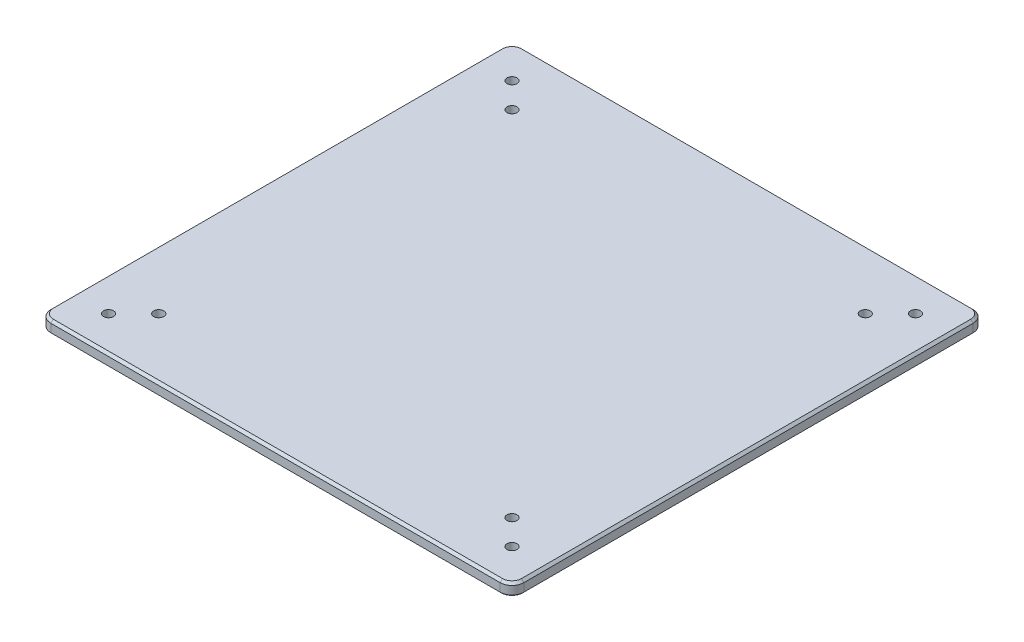
ISO-10303-21;
HEADER;
FILE_DESCRIPTION(('STEP AP214'),'2;1');
FILE_NAME('part.step','',(''),(''),'','','');
FILE_SCHEMA(('AUTOMOTIVE_DESIGN { 1 0 10303 214 1 1 1 1 }'));
ENDSEC;
DATA;
#1=APPLICATION_CONTEXT('core data for automotive mechanical design processes');
#2=APPLICATION_PROTOCOL_DEFINITION('international standard','automotive_design',2000,#1);
#3=PRODUCT_CONTEXT('',#1,'mechanical');
#4=PRODUCT('Part','Part','',(#3));
#5=PRODUCT_RELATED_PRODUCT_CATEGORY('part','',(#4));
#6=PRODUCT_DEFINITION_FORMATION('','',#4);
#7=PRODUCT_DEFINITION_CONTEXT('part definition',#1,'design');
#8=PRODUCT_DEFINITION('design','',#6,#7);
#9=PRODUCT_DEFINITION_SHAPE('','',#8);
#10=(LENGTH_UNIT() NAMED_UNIT(*) SI_UNIT(.MILLI.,.METRE.));
#11=(NAMED_UNIT(*) PLANE_ANGLE_UNIT() SI_UNIT($,.RADIAN.));
#12=(NAMED_UNIT(*) SI_UNIT($,.STERADIAN.) SOLID_ANGLE_UNIT());
#13=UNCERTAINTY_MEASURE_WITH_UNIT(LENGTH_MEASURE(1.E-05),#10,'distance_accuracy_value','');
#14=(GEOMETRIC_REPRESENTATION_CONTEXT(3) GLOBAL_UNCERTAINTY_ASSIGNED_CONTEXT((#13)) GLOBAL_UNIT_ASSIGNED_CONTEXT((#10,
#11,#12)) REPRESENTATION_CONTEXT('',''));
#15=CARTESIAN_POINT('',(0.,0.,0.));
#16=DIRECTION('',(0.,0.,1.));
#17=DIRECTION('',(1.,0.,0.));
#18=AXIS2_PLACEMENT_3D('',#15,#16,#17);
#19=CARTESIAN_POINT('',(0.,5.,0.));
#20=DIRECTION('',(-1.,0.,0.));
#21=DIRECTION('',(0.,0.,1.));
#22=AXIS2_PLACEMENT_3D('',#19,#20,#21);
#23=PLANE('',#22);
#24=DIRECTION('',(0.,-1.,0.));
#25=VECTOR('',#24,1.);
#26=CARTESIAN_POINT('',(0.,5.,195.));
#27=LINE('',#26,#25);
#28=CARTESIAN_POINT('',(0.,4.00000000000006,195.));
#29=VERTEX_POINT('',#28);
#30=CARTESIAN_POINT('',(0.,0.5,195.));
#31=VERTEX_POINT('',#30);
#32=EDGE_CURVE('E294',#29,#31,#27,.T.);
#33=ORIENTED_EDGE('',*,*,#32,.T.);
#34=DIRECTION('',(0.,0.,-1.));
#35=VECTOR('',#34,1.);
#36=CARTESIAN_POINT('',(0.,0.5,5.));
#37=LINE('',#36,#35);
#38=CARTESIAN_POINT('',(0.,0.5,5.));
#39=VERTEX_POINT('',#38);
#40=EDGE_CURVE('E185',#31,#39,#37,.T.);
#41=ORIENTED_EDGE('',*,*,#40,.T.);
#42=DIRECTION('',(0.,-1.,0.));
#43=VECTOR('',#42,1.);
#44=CARTESIAN_POINT('',(0.,5.,5.));
#45=LINE('',#44,#43);
#46=CARTESIAN_POINT('',(0.,4.00000000000006,5.));
#47=VERTEX_POINT('',#46);
#48=EDGE_CURVE('E297',#39,#47,#45,.F.);
#49=ORIENTED_EDGE('',*,*,#48,.T.);
#50=DIRECTION('',(0.,0.,1.));
#51=VECTOR('',#50,1.);
#52=CARTESIAN_POINT('',(0.,4.00000000000006,0.));
#53=LINE('',#52,#51);
#54=EDGE_CURVE('E313',#47,#29,#53,.T.);
#55=ORIENTED_EDGE('',*,*,#54,.T.);
#56=EDGE_LOOP('',(#33,#41,#49,#55));
#57=FACE_BOUND('',#56,.T.);
#58=ADVANCED_FACE('F33',(#57),#23,.F.);
#59=CARTESIAN_POINT('',(0.,5.,0.));
#60=DIRECTION('',(0.,0.,1.));
#61=DIRECTION('',(1.,0.,0.));
#62=AXIS2_PLACEMENT_3D('',#59,#60,#61);
#63=PLANE('',#62);
#64=DIRECTION('',(0.,-1.,0.));
#65=VECTOR('',#64,1.);
#66=CARTESIAN_POINT('',(-5.,5.,0.));
#67=LINE('',#66,#65);
#68=CARTESIAN_POINT('',(-5.,4.00000000000006,0.));
#69=VERTEX_POINT('',#68);
#70=CARTESIAN_POINT('',(-5.,0.5,0.));
#71=VERTEX_POINT('',#70);
#72=EDGE_CURVE('E285',#69,#71,#67,.T.);
#73=ORIENTED_EDGE('',*,*,#72,.T.);
#74=DIRECTION('',(-1.,0.,0.));
#75=VECTOR('',#74,1.);
#76=CARTESIAN_POINT('',(-195.,0.5,0.));
#77=LINE('',#76,#75);
#78=CARTESIAN_POINT('',(-195.,0.5,0.));
#79=VERTEX_POINT('',#78);
#80=EDGE_CURVE('E210',#71,#79,#77,.T.);
#81=ORIENTED_EDGE('',*,*,#80,.T.);
#82=DIRECTION('',(0.,-1.,0.));
#83=VECTOR('',#82,1.);
#84=CARTESIAN_POINT('',(-195.,5.,0.));
#85=LINE('',#84,#83);
#86=CARTESIAN_POINT('',(-195.,4.00000000000006,0.));
#87=VERTEX_POINT('',#86);
#88=EDGE_CURVE('E287',#79,#87,#85,.F.);
#89=ORIENTED_EDGE('',*,*,#88,.T.);
#90=DIRECTION('',(1.,0.,0.));
#91=VECTOR('',#90,1.);
#92=CARTESIAN_POINT('',(0.,4.00000000000006,0.));
#93=LINE('',#92,#91);
#94=EDGE_CURVE('E262',#87,#69,#93,.T.);
#95=ORIENTED_EDGE('',*,*,#94,.T.);
#96=EDGE_LOOP('',(#73,#81,#89,#95));
#97=FACE_BOUND('',#96,.T.);
#98=ADVANCED_FACE('F354',(#97),#63,.F.);
#99=CARTESIAN_POINT('',(-200.,5.,0.));
#100=DIRECTION('',(1.,0.,0.));
#101=DIRECTION('',(0.,0.,-1.));
#102=AXIS2_PLACEMENT_3D('',#99,#100,#101);
#103=PLANE('',#102);
#104=DIRECTION('',(0.,-1.,0.));
#105=VECTOR('',#104,1.);
#106=CARTESIAN_POINT('',(-200.,5.,5.));
#107=LINE('',#106,#105);
#108=CARTESIAN_POINT('',(-200.,4.00000000000006,5.));
#109=VERTEX_POINT('',#108);
#110=CARTESIAN_POINT('',(-200.,0.5,5.));
#111=VERTEX_POINT('',#110);
#112=EDGE_CURVE('E282',#109,#111,#107,.T.);
#113=ORIENTED_EDGE('',*,*,#112,.T.);
#114=DIRECTION('',(0.,0.,1.));
#115=VECTOR('',#114,1.);
#116=CARTESIAN_POINT('',(-200.,0.5,195.));
#117=LINE('',#116,#115);
#118=CARTESIAN_POINT('',(-200.,0.5,195.));
#119=VERTEX_POINT('',#118);
#120=EDGE_CURVE('E11',#111,#119,#117,.T.);
#121=ORIENTED_EDGE('',*,*,#120,.T.);
#122=DIRECTION('',(0.,-1.,0.));
#123=VECTOR('',#122,1.);
#124=CARTESIAN_POINT('',(-200.,5.,195.));
#125=LINE('',#124,#123);
#126=CARTESIAN_POINT('',(-200.,4.00000000000006,195.));
#127=VERTEX_POINT('',#126);
#128=EDGE_CURVE('E283',#119,#127,#125,.F.);
#129=ORIENTED_EDGE('',*,*,#128,.T.);
#130=DIRECTION('',(0.,0.,-1.));
#131=VECTOR('',#130,1.);
#132=CARTESIAN_POINT('',(-200.,4.00000000000006,0.));
#133=LINE('',#132,#131);
#134=EDGE_CURVE('E189',#127,#109,#133,.T.);
#135=ORIENTED_EDGE('',*,*,#134,.T.);
#136=EDGE_LOOP('',(#113,#121,#129,#135));
#137=FACE_BOUND('',#136,.T.);
#138=ADVANCED_FACE('F281',(#137),#103,.F.);
#139=CARTESIAN_POINT('',(0.,5.,200.));
#140=DIRECTION('',(0.,0.,-1.));
#141=DIRECTION('',(-1.,0.,0.));
#142=AXIS2_PLACEMENT_3D('',#139,#140,#141);
#143=PLANE('',#142);
#144=DIRECTION('',(0.,-1.,0.));
#145=VECTOR('',#144,1.);
#146=CARTESIAN_POINT('',(-195.,5.,200.));
#147=LINE('',#146,#145);
#148=CARTESIAN_POINT('',(-195.,4.00000000000006,200.));
#149=VERTEX_POINT('',#148);
#150=CARTESIAN_POINT('',(-195.,0.5,200.));
#151=VERTEX_POINT('',#150);
#152=EDGE_CURVE('E299',#149,#151,#147,.T.);
#153=ORIENTED_EDGE('',*,*,#152,.T.);
#154=DIRECTION('',(1.,0.,0.));
#155=VECTOR('',#154,1.);
#156=CARTESIAN_POINT('',(-4.99999999999997,0.5,200.));
#157=LINE('',#156,#155);
#158=CARTESIAN_POINT('',(-4.99999999999998,0.5,200.));
#159=VERTEX_POINT('',#158);
#160=EDGE_CURVE('E212',#151,#159,#157,.T.);
#161=ORIENTED_EDGE('',*,*,#160,.T.);
#162=DIRECTION('',(0.,-1.,0.));
#163=VECTOR('',#162,1.);
#164=CARTESIAN_POINT('',(-4.99999999999998,5.,200.));
#165=LINE('',#164,#163);
#166=CARTESIAN_POINT('',(-4.99999999999998,4.00000000000006,200.));
#167=VERTEX_POINT('',#166);
#168=EDGE_CURVE('E171',#159,#167,#165,.F.);
#169=ORIENTED_EDGE('',*,*,#168,.T.);
#170=DIRECTION('',(-1.,0.,0.));
#171=VECTOR('',#170,1.);
#172=CARTESIAN_POINT('',(0.,4.00000000000006,200.));
#173=LINE('',#172,#171);
#174=EDGE_CURVE('E267',#167,#149,#173,.T.);
#175=ORIENTED_EDGE('',*,*,#174,.T.);
#176=EDGE_LOOP('',(#153,#161,#169,#175));
#177=FACE_BOUND('',#176,.T.);
#178=ADVANCED_FACE('F340',(#177),#143,.F.);
#179=CARTESIAN_POINT('',(0.,5.,0.));
#180=DIRECTION('',(0.,-1.,0.));
#181=DIRECTION('',(0.,0.,-1.));
#182=AXIS2_PLACEMENT_3D('',#179,#180,#181);
#183=PLANE('',#182);
#184=CARTESIAN_POINT('',(-4.99999999999998,5.,195.));
#185=DIRECTION('',(0.,-1.,0.));
#186=DIRECTION('',(0.,0.,-1.));
#187=AXIS2_PLACEMENT_3D('',#184,#185,#186);
#188=CIRCLE('',#187,4.00000000000005);
#189=CARTESIAN_POINT('',(-4.99999999999998,5.,199.));
#190=VERTEX_POINT('',#189);
#191=CARTESIAN_POINT('',(-0.999999999999922,5.,195.));
#192=VERTEX_POINT('',#191);
#193=EDGE_CURVE('E306',#190,#192,#188,.F.);
#194=ORIENTED_EDGE('',*,*,#193,.T.);
#195=DIRECTION('',(0.,0.,-1.));
#196=VECTOR('',#195,1.);
#197=CARTESIAN_POINT('',(-0.999999999999945,5.,0.));
#198=LINE('',#197,#196);
#199=CARTESIAN_POINT('',(-0.999999999999945,5.,5.));
#200=VERTEX_POINT('',#199);
#201=EDGE_CURVE('E310',#192,#200,#198,.T.);
#202=ORIENTED_EDGE('',*,*,#201,.T.);
#203=CARTESIAN_POINT('',(-5.,5.,5.));
#204=DIRECTION('',(0.,-1.,0.));
#205=DIRECTION('',(0.,0.,-1.));
#206=AXIS2_PLACEMENT_3D('',#203,#204,#205);
#207=CIRCLE('',#206,4.00000000000006);
#208=CARTESIAN_POINT('',(-5.,5.,0.999999999999945));
#209=VERTEX_POINT('',#208);
#210=EDGE_CURVE('E308',#200,#209,#207,.F.);
#211=ORIENTED_EDGE('',*,*,#210,.T.);
#212=DIRECTION('',(-1.,0.,0.));
#213=VECTOR('',#212,1.);
#214=CARTESIAN_POINT('',(0.,5.,0.999999999999945));
#215=LINE('',#214,#213);
#216=CARTESIAN_POINT('',(-195.,5.,0.999999999999941));
#217=VERTEX_POINT('',#216);
#218=EDGE_CURVE('E154',#209,#217,#215,.T.);
#219=ORIENTED_EDGE('',*,*,#218,.T.);
#220=CARTESIAN_POINT('',(-195.,5.,5.));
#221=DIRECTION('',(0.,-1.,0.));
#222=DIRECTION('',(0.,0.,-1.));
#223=AXIS2_PLACEMENT_3D('',#220,#221,#222);
#224=CIRCLE('',#223,4.00000000000006);
#225=CARTESIAN_POINT('',(-199.,5.,5.));
#226=VERTEX_POINT('',#225);
#227=EDGE_CURVE('E147',#217,#226,#224,.F.);
#228=ORIENTED_EDGE('',*,*,#227,.T.);
#229=DIRECTION('',(0.,0.,1.));
#230=VECTOR('',#229,1.);
#231=CARTESIAN_POINT('',(-199.,5.,0.));
#232=LINE('',#231,#230);
#233=CARTESIAN_POINT('',(-199.,5.,195.));
#234=VERTEX_POINT('',#233);
#235=EDGE_CURVE('E151',#226,#234,#232,.T.);
#236=ORIENTED_EDGE('',*,*,#235,.T.);
#237=CARTESIAN_POINT('',(-195.,5.,195.));
#238=DIRECTION('',(0.,-1.,0.));
#239=DIRECTION('',(0.,0.,-1.));
#240=AXIS2_PLACEMENT_3D('',#237,#238,#239);
#241=CIRCLE('',#240,4.00000000000006);
#242=CARTESIAN_POINT('',(-195.,5.,199.));
#243=VERTEX_POINT('',#242);
#244=EDGE_CURVE('E160',#234,#243,#241,.F.);
#245=ORIENTED_EDGE('',*,*,#244,.T.);
#246=DIRECTION('',(1.,0.,0.));
#247=VECTOR('',#246,1.);
#248=CARTESIAN_POINT('',(0.,5.,199.));
#249=LINE('',#248,#247);
#250=EDGE_CURVE('E159',#243,#190,#249,.T.);
#251=ORIENTED_EDGE('',*,*,#250,.T.);
#252=EDGE_LOOP('',(#194,#202,#211,#219,#228,#236,#245,#251));
#253=FACE_BOUND('',#252,.T.);
#254=CARTESIAN_POINT('',(-14.692576694209,5.,14.6925766942088));
#255=DIRECTION('',(0.,1.,0.));
#256=DIRECTION('',(0.,0.,1.));
#257=AXIS2_PLACEMENT_3D('',#254,#255,#256);
#258=CIRCLE('',#257,2.12499999999997);
#259=CARTESIAN_POINT('',(-14.692576694209,5.,16.8175766942088));
#260=VERTEX_POINT('',#259);
#261=EDGE_CURVE('E692',#260,#260,#258,.T.);
#262=ORIENTED_EDGE('',*,*,#261,.F.);
#263=EDGE_LOOP('',(#262));
#264=FACE_BOUND('',#263,.T.);
#265=CARTESIAN_POINT('',(-174.696699141101,5.,25.2991784120071));
#266=DIRECTION('',(0.,1.,0.));
#267=DIRECTION('',(0.,0.,1.));
#268=AXIS2_PLACEMENT_3D('',#265,#266,#267);
#269=CIRCLE('',#268,2.12499999999997);
#270=CARTESIAN_POINT('',(-174.696699141101,5.,27.4241784120071));
#271=VERTEX_POINT('',#270);
#272=EDGE_CURVE('E696',#271,#271,#269,.T.);
#273=ORIENTED_EDGE('',*,*,#272,.F.);
#274=EDGE_LOOP('',(#273));
#275=FACE_BOUND('',#274,.T.);
#276=CARTESIAN_POINT('',(-185.303300858899,5.,14.6925766942089));
#277=DIRECTION('',(0.,1.,0.));
#278=DIRECTION('',(0.,0.,1.));
#279=AXIS2_PLACEMENT_3D('',#276,#277,#278);
#280=CIRCLE('',#279,2.12499999999998);
#281=CARTESIAN_POINT('',(-185.303300858899,5.,16.8175766942089));
#282=VERTEX_POINT('',#281);
#283=EDGE_CURVE('E684',#282,#282,#280,.T.);
#284=ORIENTED_EDGE('',*,*,#283,.F.);
#285=EDGE_LOOP('',(#284));
#286=FACE_BOUND('',#285,.T.);
#287=CARTESIAN_POINT('',(-174.696699141101,5.,174.696699141101));
#288=DIRECTION('',(0.,1.,0.));
#289=DIRECTION('',(0.,0.,1.));
#290=AXIS2_PLACEMENT_3D('',#287,#288,#289);
#291=CIRCLE('',#290,2.12499999999998);
#292=CARTESIAN_POINT('',(-174.696699141101,5.,176.821699141101));
#293=VERTEX_POINT('',#292);
#294=EDGE_CURVE('E688',#293,#293,#291,.T.);
#295=ORIENTED_EDGE('',*,*,#294,.F.);
#296=EDGE_LOOP('',(#295));
#297=FACE_BOUND('',#296,.T.);
#298=CARTESIAN_POINT('',(-25.2991784120072,5.,174.696699141101));
#299=DIRECTION('',(0.,1.,0.));
#300=DIRECTION('',(0.,0.,1.));
#301=AXIS2_PLACEMENT_3D('',#298,#299,#300);
#302=CIRCLE('',#301,2.125);
#303=CARTESIAN_POINT('',(-25.2991784120072,5.,176.821699141101));
#304=VERTEX_POINT('',#303);
#305=EDGE_CURVE('E178',#304,#304,#302,.T.);
#306=ORIENTED_EDGE('',*,*,#305,.F.);
#307=EDGE_LOOP('',(#306));
#308=FACE_BOUND('',#307,.T.);
#309=CARTESIAN_POINT('',(-14.6925766942089,5.,185.303300858899));
#310=DIRECTION('',(0.,1.,0.));
#311=DIRECTION('',(0.,0.,1.));
#312=AXIS2_PLACEMENT_3D('',#309,#310,#311);
#313=CIRCLE('',#312,2.125);
#314=CARTESIAN_POINT('',(-14.6925766942089,5.,187.428300858899));
#315=VERTEX_POINT('',#314);
#316=EDGE_CURVE('E700',#315,#315,#313,.T.);
#317=ORIENTED_EDGE('',*,*,#316,.F.);
#318=EDGE_LOOP('',(#317));
#319=FACE_BOUND('',#318,.T.);
#320=CARTESIAN_POINT('',(-25.2991784120072,5.,25.2991784120071));
#321=DIRECTION('',(0.,1.,0.));
#322=DIRECTION('',(0.,0.,1.));
#323=AXIS2_PLACEMENT_3D('',#320,#321,#322);
#324=CIRCLE('',#323,2.12499999999998);
#325=CARTESIAN_POINT('',(-25.2991784120072,5.,27.4241784120071));
#326=VERTEX_POINT('',#325);
#327=EDGE_CURVE('E704',#326,#326,#324,.T.);
#328=ORIENTED_EDGE('',*,*,#327,.F.);
#329=EDGE_LOOP('',(#328));
#330=FACE_BOUND('',#329,.T.);
#331=CARTESIAN_POINT('',(-185.303300858899,5.,185.303300858899));
#332=DIRECTION('',(0.,1.,0.));
#333=DIRECTION('',(0.,0.,1.));
#334=AXIS2_PLACEMENT_3D('',#331,#332,#333);
#335=CIRCLE('',#334,2.12499999999998);
#336=CARTESIAN_POINT('',(-185.303300858899,5.,187.428300858899));
#337=VERTEX_POINT('',#336);
#338=EDGE_CURVE('E680',#337,#337,#335,.T.);
#339=ORIENTED_EDGE('',*,*,#338,.F.);
#340=EDGE_LOOP('',(#339));
#341=FACE_BOUND('',#340,.T.);
#342=ADVANCED_FACE('F149',(#253,#264,#275,#286,#297,#308,#319,#330,#341),#183,.F.);
#343=CARTESIAN_POINT('',(0.,0.,0.));
#344=DIRECTION('',(0.,-1.,0.));
#345=DIRECTION('',(0.,0.,-1.));
#346=AXIS2_PLACEMENT_3D('',#343,#344,#345);
#347=PLANE('',#346);
#348=CARTESIAN_POINT('',(-5.,0.,5.));
#349=DIRECTION('',(0.,-1.,0.));
#350=DIRECTION('',(0.,0.,-1.));
#351=AXIS2_PLACEMENT_3D('',#348,#349,#350);
#352=CIRCLE('',#351,4.5);
#353=CARTESIAN_POINT('',(-5.,0.,0.5));
#354=VERTEX_POINT('',#353);
#355=CARTESIAN_POINT('',(-0.5,0.,5.));
#356=VERTEX_POINT('',#355);
#357=EDGE_CURVE('E201',#354,#356,#352,.T.);
#358=ORIENTED_EDGE('',*,*,#357,.T.);
#359=DIRECTION('',(0.,0.,1.));
#360=VECTOR('',#359,1.);
#361=CARTESIAN_POINT('',(-0.499999999999977,0.,195.));
#362=LINE('',#361,#360);
#363=CARTESIAN_POINT('',(-0.499999999999971,0.,195.));
#364=VERTEX_POINT('',#363);
#365=EDGE_CURVE('E203',#356,#364,#362,.T.);
#366=ORIENTED_EDGE('',*,*,#365,.T.);
#367=CARTESIAN_POINT('',(-4.99999999999998,0.,195.));
#368=DIRECTION('',(0.,-1.,0.));
#369=DIRECTION('',(0.,0.,-1.));
#370=AXIS2_PLACEMENT_3D('',#367,#368,#369);
#371=CIRCLE('',#370,4.5);
#372=CARTESIAN_POINT('',(-4.99999999999998,0.,199.5));
#373=VERTEX_POINT('',#372);
#374=EDGE_CURVE('E199',#364,#373,#371,.T.);
#375=ORIENTED_EDGE('',*,*,#374,.T.);
#376=DIRECTION('',(-1.,0.,0.));
#377=VECTOR('',#376,1.);
#378=CARTESIAN_POINT('',(-195.,0.,199.5));
#379=LINE('',#378,#377);
#380=CARTESIAN_POINT('',(-195.,0.,199.5));
#381=VERTEX_POINT('',#380);
#382=EDGE_CURVE('E195',#373,#381,#379,.T.);
#383=ORIENTED_EDGE('',*,*,#382,.T.);
#384=CARTESIAN_POINT('',(-195.,0.,195.));
#385=DIRECTION('',(0.,-1.,0.));
#386=DIRECTION('',(0.,0.,-1.));
#387=AXIS2_PLACEMENT_3D('',#384,#385,#386);
#388=CIRCLE('',#387,4.5);
#389=CARTESIAN_POINT('',(-199.5,0.,195.));
#390=VERTEX_POINT('',#389);
#391=EDGE_CURVE('E191',#381,#390,#388,.T.);
#392=ORIENTED_EDGE('',*,*,#391,.T.);
#393=DIRECTION('',(0.,0.,-1.));
#394=VECTOR('',#393,1.);
#395=CARTESIAN_POINT('',(-199.5,0.,5.));
#396=LINE('',#395,#394);
#397=CARTESIAN_POINT('',(-199.5,0.,5.));
#398=VERTEX_POINT('',#397);
#399=EDGE_CURVE('E188',#390,#398,#396,.T.);
#400=ORIENTED_EDGE('',*,*,#399,.T.);
#401=CARTESIAN_POINT('',(-195.,0.,5.));
#402=DIRECTION('',(0.,-1.,0.));
#403=DIRECTION('',(0.,0.,-1.));
#404=AXIS2_PLACEMENT_3D('',#401,#402,#403);
#405=CIRCLE('',#404,4.5);
#406=CARTESIAN_POINT('',(-195.,0.,0.499999999999996));
#407=VERTEX_POINT('',#406);
#408=EDGE_CURVE('E193',#398,#407,#405,.T.);
#409=ORIENTED_EDGE('',*,*,#408,.T.);
#410=DIRECTION('',(1.,0.,0.));
#411=VECTOR('',#410,1.);
#412=CARTESIAN_POINT('',(-5.,0.,0.5));
#413=LINE('',#412,#411);
#414=EDGE_CURVE('E197',#407,#354,#413,.T.);
#415=ORIENTED_EDGE('',*,*,#414,.T.);
#416=EDGE_LOOP('',(#358,#366,#375,#383,#392,#400,#409,#415));
#417=FACE_BOUND('',#416,.T.);
#418=CARTESIAN_POINT('',(-14.692576694209,0.,14.6925766942088));
#419=DIRECTION('',(0.,1.,0.));
#420=DIRECTION('',(0.,0.,1.));
#421=AXIS2_PLACEMENT_3D('',#418,#419,#420);
#422=CIRCLE('',#421,2.12499999999997);
#423=CARTESIAN_POINT('',(-14.692576694209,0.,16.8175766942088));
#424=VERTEX_POINT('',#423);
#425=EDGE_CURVE('E653',#424,#424,#422,.T.);
#426=ORIENTED_EDGE('',*,*,#425,.T.);
#427=EDGE_LOOP('',(#426));
#428=FACE_BOUND('',#427,.T.);
#429=CARTESIAN_POINT('',(-174.696699141101,0.,25.2991784120071));
#430=DIRECTION('',(0.,1.,0.));
#431=DIRECTION('',(0.,0.,1.));
#432=AXIS2_PLACEMENT_3D('',#429,#430,#431);
#433=CIRCLE('',#432,2.12499999999997);
#434=CARTESIAN_POINT('',(-174.696699141101,0.,27.4241784120071));
#435=VERTEX_POINT('',#434);
#436=EDGE_CURVE('E657',#435,#435,#433,.T.);
#437=ORIENTED_EDGE('',*,*,#436,.T.);
#438=EDGE_LOOP('',(#437));
#439=FACE_BOUND('',#438,.T.);
#440=CARTESIAN_POINT('',(-185.303300858899,0.,14.6925766942089));
#441=DIRECTION('',(0.,1.,0.));
#442=DIRECTION('',(0.,0.,1.));
#443=AXIS2_PLACEMENT_3D('',#440,#441,#442);
#444=CIRCLE('',#443,2.12499999999998);
#445=CARTESIAN_POINT('',(-185.303300858899,0.,16.8175766942089));
#446=VERTEX_POINT('',#445);
#447=EDGE_CURVE('E661',#446,#446,#444,.T.);
#448=ORIENTED_EDGE('',*,*,#447,.T.);
#449=EDGE_LOOP('',(#448));
#450=FACE_BOUND('',#449,.T.);
#451=CARTESIAN_POINT('',(-174.696699141101,0.,174.696699141101));
#452=DIRECTION('',(0.,1.,0.));
#453=DIRECTION('',(0.,0.,1.));
#454=AXIS2_PLACEMENT_3D('',#451,#452,#453);
#455=CIRCLE('',#454,2.12499999999998);
#456=CARTESIAN_POINT('',(-174.696699141101,0.,176.821699141101));
#457=VERTEX_POINT('',#456);
#458=EDGE_CURVE('E665',#457,#457,#455,.T.);
#459=ORIENTED_EDGE('',*,*,#458,.T.);
#460=EDGE_LOOP('',(#459));
#461=FACE_BOUND('',#460,.T.);
#462=CARTESIAN_POINT('',(-25.2991784120072,0.,174.696699141101));
#463=DIRECTION('',(0.,1.,0.));
#464=DIRECTION('',(0.,0.,1.));
#465=AXIS2_PLACEMENT_3D('',#462,#463,#464);
#466=CIRCLE('',#465,2.125);
#467=CARTESIAN_POINT('',(-25.2991784120072,0.,176.821699141101));
#468=VERTEX_POINT('',#467);
#469=EDGE_CURVE('E669',#468,#468,#466,.T.);
#470=ORIENTED_EDGE('',*,*,#469,.T.);
#471=EDGE_LOOP('',(#470));
#472=FACE_BOUND('',#471,.T.);
#473=CARTESIAN_POINT('',(-14.6925766942089,0.,185.303300858899));
#474=DIRECTION('',(0.,1.,0.));
#475=DIRECTION('',(0.,0.,1.));
#476=AXIS2_PLACEMENT_3D('',#473,#474,#475);
#477=CIRCLE('',#476,2.125);
#478=CARTESIAN_POINT('',(-14.6925766942089,0.,187.428300858899));
#479=VERTEX_POINT('',#478);
#480=EDGE_CURVE('E673',#479,#479,#477,.T.);
#481=ORIENTED_EDGE('',*,*,#480,.T.);
#482=EDGE_LOOP('',(#481));
#483=FACE_BOUND('',#482,.T.);
#484=CARTESIAN_POINT('',(-25.2991784120072,0.,25.2991784120071));
#485=DIRECTION('',(0.,1.,0.));
#486=DIRECTION('',(0.,0.,1.));
#487=AXIS2_PLACEMENT_3D('',#484,#485,#486);
#488=CIRCLE('',#487,2.12499999999998);
#489=CARTESIAN_POINT('',(-25.2991784120072,0.,27.4241784120071));
#490=VERTEX_POINT('',#489);
#491=EDGE_CURVE('E677',#490,#490,#488,.T.);
#492=ORIENTED_EDGE('',*,*,#491,.T.);
#493=EDGE_LOOP('',(#492));
#494=FACE_BOUND('',#493,.T.);
#495=CARTESIAN_POINT('',(-185.303300858899,0.,185.303300858899));
#496=DIRECTION('',(0.,1.,0.));
#497=DIRECTION('',(0.,0.,1.));
#498=AXIS2_PLACEMENT_3D('',#495,#496,#497);
#499=CIRCLE('',#498,2.12499999999998);
#500=CARTESIAN_POINT('',(-185.303300858899,0.,187.428300858899));
#501=VERTEX_POINT('',#500);
#502=EDGE_CURVE('E289',#501,#501,#499,.T.);
#503=ORIENTED_EDGE('',*,*,#502,.T.);
#504=EDGE_LOOP('',(#503));
#505=FACE_BOUND('',#504,.T.);
#506=ADVANCED_FACE('F591',(#417,#428,#439,#450,#461,#472,#483,#494,#505),#347,.T.);
#507=CARTESIAN_POINT('',(-185.303300858899,0.,185.303300858899));
#508=DIRECTION('',(0.,1.,0.));
#509=DIRECTION('',(0.,0.,1.));
#510=AXIS2_PLACEMENT_3D('',#507,#508,#509);
#511=CYLINDRICAL_SURFACE('',#510,2.12499999999998);
#512=ORIENTED_EDGE('',*,*,#502,.F.);
#513=EDGE_LOOP('',(#512));
#514=FACE_BOUND('',#513,.T.);
#515=ORIENTED_EDGE('',*,*,#338,.T.);
#516=EDGE_LOOP('',(#515));
#517=FACE_BOUND('',#516,.T.);
#518=ADVANCED_FACE('F582',(#514,#517),#511,.F.);
#519=CARTESIAN_POINT('',(-25.2991784120072,0.,25.2991784120071));
#520=DIRECTION('',(0.,1.,0.));
#521=DIRECTION('',(0.,0.,1.));
#522=AXIS2_PLACEMENT_3D('',#519,#520,#521);
#523=CYLINDRICAL_SURFACE('',#522,2.12499999999998);
#524=ORIENTED_EDGE('',*,*,#491,.F.);
#525=EDGE_LOOP('',(#524));
#526=FACE_BOUND('',#525,.T.);
#527=ORIENTED_EDGE('',*,*,#327,.T.);
#528=EDGE_LOOP('',(#527));
#529=FACE_BOUND('',#528,.T.);
#530=ADVANCED_FACE('F573',(#526,#529),#523,.F.);
#531=CARTESIAN_POINT('',(-14.6925766942089,0.,185.303300858899));
#532=DIRECTION('',(0.,1.,0.));
#533=DIRECTION('',(0.,0.,1.));
#534=AXIS2_PLACEMENT_3D('',#531,#532,#533);
#535=CYLINDRICAL_SURFACE('',#534,2.125);
#536=ORIENTED_EDGE('',*,*,#480,.F.);
#537=EDGE_LOOP('',(#536));
#538=FACE_BOUND('',#537,.T.);
#539=ORIENTED_EDGE('',*,*,#316,.T.);
#540=EDGE_LOOP('',(#539));
#541=FACE_BOUND('',#540,.T.);
#542=ADVANCED_FACE('F564',(#538,#541),#535,.F.);
#543=CARTESIAN_POINT('',(-25.2991784120072,0.,174.696699141101));
#544=DIRECTION('',(0.,1.,0.));
#545=DIRECTION('',(0.,0.,1.));
#546=AXIS2_PLACEMENT_3D('',#543,#544,#545);
#547=CYLINDRICAL_SURFACE('',#546,2.125);
#548=ORIENTED_EDGE('',*,*,#469,.F.);
#549=EDGE_LOOP('',(#548));
#550=FACE_BOUND('',#549,.T.);
#551=ORIENTED_EDGE('',*,*,#305,.T.);
#552=EDGE_LOOP('',(#551));
#553=FACE_BOUND('',#552,.T.);
#554=ADVANCED_FACE('F555',(#550,#553),#547,.F.);
#555=CARTESIAN_POINT('',(-174.696699141101,0.,174.696699141101));
#556=DIRECTION('',(0.,1.,0.));
#557=DIRECTION('',(0.,0.,1.));
#558=AXIS2_PLACEMENT_3D('',#555,#556,#557);
#559=CYLINDRICAL_SURFACE('',#558,2.12499999999998);
#560=ORIENTED_EDGE('',*,*,#458,.F.);
#561=EDGE_LOOP('',(#560));
#562=FACE_BOUND('',#561,.T.);
#563=ORIENTED_EDGE('',*,*,#294,.T.);
#564=EDGE_LOOP('',(#563));
#565=FACE_BOUND('',#564,.T.);
#566=ADVANCED_FACE('F546',(#562,#565),#559,.F.);
#567=CARTESIAN_POINT('',(-185.303300858899,0.,14.6925766942089));
#568=DIRECTION('',(0.,1.,0.));
#569=DIRECTION('',(0.,0.,1.));
#570=AXIS2_PLACEMENT_3D('',#567,#568,#569);
#571=CYLINDRICAL_SURFACE('',#570,2.12499999999998);
#572=ORIENTED_EDGE('',*,*,#447,.F.);
#573=EDGE_LOOP('',(#572));
#574=FACE_BOUND('',#573,.T.);
#575=ORIENTED_EDGE('',*,*,#283,.T.);
#576=EDGE_LOOP('',(#575));
#577=FACE_BOUND('',#576,.T.);
#578=ADVANCED_FACE('F537',(#574,#577),#571,.F.);
#579=CARTESIAN_POINT('',(-174.696699141101,0.,25.2991784120071));
#580=DIRECTION('',(0.,1.,0.));
#581=DIRECTION('',(0.,0.,1.));
#582=AXIS2_PLACEMENT_3D('',#579,#580,#581);
#583=CYLINDRICAL_SURFACE('',#582,2.12499999999997);
#584=ORIENTED_EDGE('',*,*,#436,.F.);
#585=EDGE_LOOP('',(#584));
#586=FACE_BOUND('',#585,.T.);
#587=ORIENTED_EDGE('',*,*,#272,.T.);
#588=EDGE_LOOP('',(#587));
#589=FACE_BOUND('',#588,.T.);
#590=ADVANCED_FACE('F528',(#586,#589),#583,.F.);
#591=CARTESIAN_POINT('',(-14.692576694209,0.,14.6925766942088));
#592=DIRECTION('',(0.,1.,0.));
#593=DIRECTION('',(0.,0.,1.));
#594=AXIS2_PLACEMENT_3D('',#591,#592,#593);
#595=CYLINDRICAL_SURFACE('',#594,2.12499999999997);
#596=ORIENTED_EDGE('',*,*,#425,.F.);
#597=EDGE_LOOP('',(#596));
#598=FACE_BOUND('',#597,.T.);
#599=ORIENTED_EDGE('',*,*,#261,.T.);
#600=EDGE_LOOP('',(#599));
#601=FACE_BOUND('',#600,.T.);
#602=ADVANCED_FACE('F364',(#598,#601),#595,.F.);
#603=CARTESIAN_POINT('',(-195.,5.,5.));
#604=DIRECTION('',(0.,-1.,0.));
#605=DIRECTION('',(0.,0.,-1.));
#606=AXIS2_PLACEMENT_3D('',#603,#604,#605);
#607=CYLINDRICAL_SURFACE('',#606,5.);
#608=ORIENTED_EDGE('',*,*,#88,.F.);
#609=CARTESIAN_POINT('',(-195.,0.5,5.));
#610=DIRECTION('',(0.,-1.,0.));
#611=DIRECTION('',(0.,0.,-1.));
#612=AXIS2_PLACEMENT_3D('',#609,#610,#611);
#613=CIRCLE('',#612,5.);
#614=EDGE_CURVE('E56',#79,#111,#613,.F.);
#615=ORIENTED_EDGE('',*,*,#614,.T.);
#616=ORIENTED_EDGE('',*,*,#112,.F.);
#617=CARTESIAN_POINT('',(-195.,4.00000000000006,5.));
#618=DIRECTION('',(0.,-1.,0.));
#619=DIRECTION('',(0.,0.,-1.));
#620=AXIS2_PLACEMENT_3D('',#617,#618,#619);
#621=CIRCLE('',#620,5.);
#622=EDGE_CURVE('E175',#109,#87,#621,.T.);
#623=ORIENTED_EDGE('',*,*,#622,.T.);
#624=EDGE_LOOP('',(#608,#615,#616,#623));
#625=FACE_BOUND('',#624,.T.);
#626=ADVANCED_FACE('F284',(#625),#607,.T.);
#627=CARTESIAN_POINT('',(-5.,5.,5.));
#628=DIRECTION('',(0.,-1.,0.));
#629=DIRECTION('',(0.,0.,-1.));
#630=AXIS2_PLACEMENT_3D('',#627,#628,#629);
#631=CYLINDRICAL_SURFACE('',#630,5.);
#632=ORIENTED_EDGE('',*,*,#48,.F.);
#633=CARTESIAN_POINT('',(-5.,0.5,5.));
#634=DIRECTION('',(0.,-1.,0.));
#635=DIRECTION('',(0.,0.,-1.));
#636=AXIS2_PLACEMENT_3D('',#633,#634,#635);
#637=CIRCLE('',#636,5.);
#638=EDGE_CURVE('E206',#39,#71,#637,.F.);
#639=ORIENTED_EDGE('',*,*,#638,.T.);
#640=ORIENTED_EDGE('',*,*,#72,.F.);
#641=CARTESIAN_POINT('',(-5.,4.00000000000006,5.));
#642=DIRECTION('',(0.,-1.,0.));
#643=DIRECTION('',(0.,0.,-1.));
#644=AXIS2_PLACEMENT_3D('',#641,#642,#643);
#645=CIRCLE('',#644,5.);
#646=EDGE_CURVE('E272',#69,#47,#645,.T.);
#647=ORIENTED_EDGE('',*,*,#646,.T.);
#648=EDGE_LOOP('',(#632,#639,#640,#647));
#649=FACE_BOUND('',#648,.T.);
#650=ADVANCED_FACE('F318',(#649),#631,.T.);
#651=CARTESIAN_POINT('',(-4.99999999999998,5.,195.));
#652=DIRECTION('',(0.,-1.,0.));
#653=DIRECTION('',(0.,0.,-1.));
#654=AXIS2_PLACEMENT_3D('',#651,#652,#653);
#655=CYLINDRICAL_SURFACE('',#654,5.);
#656=ORIENTED_EDGE('',*,*,#168,.F.);
#657=CARTESIAN_POINT('',(-4.99999999999998,0.5,195.));
#658=DIRECTION('',(0.,-1.,0.));
#659=DIRECTION('',(0.,0.,-1.));
#660=AXIS2_PLACEMENT_3D('',#657,#658,#659);
#661=CIRCLE('',#660,5.);
#662=EDGE_CURVE('E208',#159,#31,#661,.F.);
#663=ORIENTED_EDGE('',*,*,#662,.T.);
#664=ORIENTED_EDGE('',*,*,#32,.F.);
#665=CARTESIAN_POINT('',(-4.99999999999998,4.00000000000006,195.));
#666=DIRECTION('',(0.,-1.,0.));
#667=DIRECTION('',(0.,0.,-1.));
#668=AXIS2_PLACEMENT_3D('',#665,#666,#667);
#669=CIRCLE('',#668,5.);
#670=EDGE_CURVE('E268',#29,#167,#669,.T.);
#671=ORIENTED_EDGE('',*,*,#670,.T.);
#672=EDGE_LOOP('',(#656,#663,#664,#671));
#673=FACE_BOUND('',#672,.T.);
#674=ADVANCED_FACE('F334',(#673),#655,.T.);
#675=CARTESIAN_POINT('',(-195.,5.,195.));
#676=DIRECTION('',(0.,-1.,0.));
#677=DIRECTION('',(0.,0.,-1.));
#678=AXIS2_PLACEMENT_3D('',#675,#676,#677);
#679=CYLINDRICAL_SURFACE('',#678,5.);
#680=ORIENTED_EDGE('',*,*,#128,.F.);
#681=CARTESIAN_POINT('',(-195.,0.5,195.));
#682=DIRECTION('',(0.,-1.,0.));
#683=DIRECTION('',(0.,0.,-1.));
#684=AXIS2_PLACEMENT_3D('',#681,#682,#683);
#685=CIRCLE('',#684,5.);
#686=EDGE_CURVE('E42',#119,#151,#685,.F.);
#687=ORIENTED_EDGE('',*,*,#686,.T.);
#688=ORIENTED_EDGE('',*,*,#152,.F.);
#689=CARTESIAN_POINT('',(-195.,4.00000000000006,195.));
#690=DIRECTION('',(0.,-1.,0.));
#691=DIRECTION('',(0.,0.,-1.));
#692=AXIS2_PLACEMENT_3D('',#689,#690,#691);
#693=CIRCLE('',#692,5.);
#694=EDGE_CURVE('E276',#149,#127,#693,.T.);
#695=ORIENTED_EDGE('',*,*,#694,.T.);
#696=EDGE_LOOP('',(#680,#687,#688,#695));
#697=FACE_BOUND('',#696,.T.);
#698=ADVANCED_FACE('F342',(#697),#679,.T.);
#699=CARTESIAN_POINT('',(-199.,5.,0.));
#700=DIRECTION('',(0.707106781186547,-0.707106781186547,0.));
#701=DIRECTION('',(0.,0.,1.));
#702=AXIS2_PLACEMENT_3D('',#699,#700,#701);
#703=PLANE('',#702);
#704=DIRECTION('',(0.707106781186547,0.707106781186547,0.));
#705=VECTOR('',#704,1.);
#706=CARTESIAN_POINT('',(-200.,4.00000000000006,5.));
#707=LINE('',#706,#705);
#708=EDGE_CURVE('E166',#109,#226,#707,.T.);
#709=ORIENTED_EDGE('',*,*,#708,.F.);
#710=ORIENTED_EDGE('',*,*,#134,.F.);
#711=DIRECTION('',(-0.707106781186547,-0.707106781186547,0.));
#712=VECTOR('',#711,1.);
#713=CARTESIAN_POINT('',(-199.,5.,195.));
#714=LINE('',#713,#712);
#715=EDGE_CURVE('E169',#234,#127,#714,.T.);
#716=ORIENTED_EDGE('',*,*,#715,.F.);
#717=ORIENTED_EDGE('',*,*,#235,.F.);
#718=EDGE_LOOP('',(#709,#710,#716,#717));
#719=FACE_BOUND('',#718,.T.);
#720=ADVANCED_FACE('F164',(#719),#703,.F.);
#721=CARTESIAN_POINT('',(-195.,5.,195.));
#722=DIRECTION('',(0.,-1.,0.));
#723=DIRECTION('',(0.,0.,-1.));
#724=AXIS2_PLACEMENT_3D('',#721,#722,#723);
#725=CONICAL_SURFACE('',#724,4.00000000000006,0.785398163397446);
#726=ORIENTED_EDGE('',*,*,#715,.T.);
#727=ORIENTED_EDGE('',*,*,#694,.F.);
#728=DIRECTION('',(0.,-0.707106781186547,0.707106781186547));
#729=VECTOR('',#728,1.);
#730=CARTESIAN_POINT('',(-195.,5.,199.));
#731=LINE('',#730,#729);
#732=EDGE_CURVE('E176',#243,#149,#731,.T.);
#733=ORIENTED_EDGE('',*,*,#732,.F.);
#734=ORIENTED_EDGE('',*,*,#244,.F.);
#735=EDGE_LOOP('',(#726,#727,#733,#734));
#736=FACE_BOUND('',#735,.T.);
#737=ADVANCED_FACE('F344',(#736),#725,.T.);
#738=CARTESIAN_POINT('',(-195.,5.,5.));
#739=DIRECTION('',(0.,-1.,0.));
#740=DIRECTION('',(0.,0.,-1.));
#741=AXIS2_PLACEMENT_3D('',#738,#739,#740);
#742=CONICAL_SURFACE('',#741,4.00000000000006,0.785398163397446);
#743=ORIENTED_EDGE('',*,*,#708,.T.);
#744=ORIENTED_EDGE('',*,*,#227,.F.);
#745=DIRECTION('',(0.,0.707106781186549,0.707106781186546));
#746=VECTOR('',#745,1.);
#747=CARTESIAN_POINT('',(-195.,4.00000000000006,0.));
#748=LINE('',#747,#746);
#749=EDGE_CURVE('E181',#87,#217,#748,.T.);
#750=ORIENTED_EDGE('',*,*,#749,.F.);
#751=ORIENTED_EDGE('',*,*,#622,.F.);
#752=EDGE_LOOP('',(#743,#744,#750,#751));
#753=FACE_BOUND('',#752,.T.);
#754=ADVANCED_FACE('F173',(#753),#742,.T.);
#755=CARTESIAN_POINT('',(0.,5.,199.));
#756=DIRECTION('',(0.,-0.707106781186547,-0.707106781186547));
#757=DIRECTION('',(1.,0.,0.));
#758=AXIS2_PLACEMENT_3D('',#755,#756,#757);
#759=PLANE('',#758);
#760=ORIENTED_EDGE('',*,*,#732,.T.);
#761=ORIENTED_EDGE('',*,*,#174,.F.);
#762=DIRECTION('',(0.,-0.707106781186547,0.707106781186547));
#763=VECTOR('',#762,1.);
#764=CARTESIAN_POINT('',(-4.99999999999998,5.,199.));
#765=LINE('',#764,#763);
#766=EDGE_CURVE('E256',#190,#167,#765,.T.);
#767=ORIENTED_EDGE('',*,*,#766,.F.);
#768=ORIENTED_EDGE('',*,*,#250,.F.);
#769=EDGE_LOOP('',(#760,#761,#767,#768));
#770=FACE_BOUND('',#769,.T.);
#771=ADVANCED_FACE('F337',(#770),#759,.F.);
#772=CARTESIAN_POINT('',(0.,5.,0.999999999999945));
#773=DIRECTION('',(0.,-0.707106781186547,0.707106781186547));
#774=DIRECTION('',(-1.,0.,0.));
#775=AXIS2_PLACEMENT_3D('',#772,#773,#774);
#776=PLANE('',#775);
#777=ORIENTED_EDGE('',*,*,#749,.T.);
#778=ORIENTED_EDGE('',*,*,#218,.F.);
#779=DIRECTION('',(0.,0.707106781186547,0.707106781186547));
#780=VECTOR('',#779,1.);
#781=CARTESIAN_POINT('',(-5.,4.00000000000006,0.));
#782=LINE('',#781,#780);
#783=EDGE_CURVE('E249',#69,#209,#782,.T.);
#784=ORIENTED_EDGE('',*,*,#783,.F.);
#785=ORIENTED_EDGE('',*,*,#94,.F.);
#786=EDGE_LOOP('',(#777,#778,#784,#785));
#787=FACE_BOUND('',#786,.T.);
#788=ADVANCED_FACE('F260',(#787),#776,.F.);
#789=CARTESIAN_POINT('',(-4.99999999999998,5.,195.));
#790=DIRECTION('',(0.,-1.,0.));
#791=DIRECTION('',(0.,0.,-1.));
#792=AXIS2_PLACEMENT_3D('',#789,#790,#791);
#793=CONICAL_SURFACE('',#792,4.00000000000005,0.785398163397449);
#794=ORIENTED_EDGE('',*,*,#766,.T.);
#795=ORIENTED_EDGE('',*,*,#670,.F.);
#796=DIRECTION('',(0.707106781186547,-0.707106781186547,0.));
#797=VECTOR('',#796,1.);
#798=CARTESIAN_POINT('',(-0.999999999999922,5.,195.));
#799=LINE('',#798,#797);
#800=EDGE_CURVE('E242',#192,#29,#799,.T.);
#801=ORIENTED_EDGE('',*,*,#800,.F.);
#802=ORIENTED_EDGE('',*,*,#193,.F.);
#803=EDGE_LOOP('',(#794,#795,#801,#802));
#804=FACE_BOUND('',#803,.T.);
#805=ADVANCED_FACE('F330',(#804),#793,.T.);
#806=CARTESIAN_POINT('',(-5.,5.,5.));
#807=DIRECTION('',(0.,-1.,0.));
#808=DIRECTION('',(0.,0.,-1.));
#809=AXIS2_PLACEMENT_3D('',#806,#807,#808);
#810=CONICAL_SURFACE('',#809,4.00000000000006,0.785398163397448);
#811=ORIENTED_EDGE('',*,*,#783,.T.);
#812=ORIENTED_EDGE('',*,*,#210,.F.);
#813=DIRECTION('',(-0.707106781186547,0.707106781186547,0.));
#814=VECTOR('',#813,1.);
#815=CARTESIAN_POINT('',(0.,4.00000000000006,5.));
#816=LINE('',#815,#814);
#817=EDGE_CURVE('E237',#47,#200,#816,.T.);
#818=ORIENTED_EDGE('',*,*,#817,.F.);
#819=ORIENTED_EDGE('',*,*,#646,.F.);
#820=EDGE_LOOP('',(#811,#812,#818,#819));
#821=FACE_BOUND('',#820,.T.);
#822=ADVANCED_FACE('F325',(#821),#810,.T.);
#823=CARTESIAN_POINT('',(-0.999999999999945,5.,0.));
#824=DIRECTION('',(-0.707106781186547,-0.707106781186547,0.));
#825=DIRECTION('',(0.,0.,-1.));
#826=AXIS2_PLACEMENT_3D('',#823,#824,#825);
#827=PLANE('',#826);
#828=ORIENTED_EDGE('',*,*,#800,.T.);
#829=ORIENTED_EDGE('',*,*,#54,.F.);
#830=ORIENTED_EDGE('',*,*,#817,.T.);
#831=ORIENTED_EDGE('',*,*,#201,.F.);
#832=EDGE_LOOP('',(#828,#829,#830,#831));
#833=FACE_BOUND('',#832,.T.);
#834=ADVANCED_FACE('F320',(#833),#827,.F.);
#835=CARTESIAN_POINT('',(-200.,0.5,0.));
#836=DIRECTION('',(-0.707106781186547,-0.707106781186547,0.));
#837=DIRECTION('',(0.,0.,-1.));
#838=AXIS2_PLACEMENT_3D('',#835,#836,#837);
#839=PLANE('',#838);
#840=DIRECTION('',(-0.707106781186547,0.707106781186547,0.));
#841=VECTOR('',#840,1.);
#842=CARTESIAN_POINT('',(-199.5,0.,5.));
#843=LINE('',#842,#841);
#844=EDGE_CURVE('E231',#398,#111,#843,.T.);
#845=ORIENTED_EDGE('',*,*,#844,.F.);
#846=ORIENTED_EDGE('',*,*,#399,.F.);
#847=DIRECTION('',(0.707106781186547,-0.707106781186547,0.));
#848=VECTOR('',#847,1.);
#849=CARTESIAN_POINT('',(-200.,0.5,195.));
#850=LINE('',#849,#848);
#851=EDGE_CURVE('E37',#119,#390,#850,.T.);
#852=ORIENTED_EDGE('',*,*,#851,.F.);
#853=ORIENTED_EDGE('',*,*,#120,.F.);
#854=EDGE_LOOP('',(#845,#846,#852,#853));
#855=FACE_BOUND('',#854,.T.);
#856=ADVANCED_FACE('F35',(#855),#839,.T.);
#857=CARTESIAN_POINT('',(-195.,0.,195.));
#858=DIRECTION('',(0.,1.,0.));
#859=DIRECTION('',(0.,0.,1.));
#860=AXIS2_PLACEMENT_3D('',#857,#858,#859);
#861=CONICAL_SURFACE('',#860,4.5,0.785398163397444);
#862=ORIENTED_EDGE('',*,*,#851,.T.);
#863=ORIENTED_EDGE('',*,*,#391,.F.);
#864=DIRECTION('',(0.,-0.707106781186547,-0.707106781186547));
#865=VECTOR('',#864,1.);
#866=CARTESIAN_POINT('',(-195.,0.5,200.));
#867=LINE('',#866,#865);
#868=EDGE_CURVE('E229',#151,#381,#867,.T.);
#869=ORIENTED_EDGE('',*,*,#868,.F.);
#870=ORIENTED_EDGE('',*,*,#686,.F.);
#871=EDGE_LOOP('',(#862,#863,#869,#870));
#872=FACE_BOUND('',#871,.T.);
#873=ADVANCED_FACE('F406',(#872),#861,.T.);
#874=CARTESIAN_POINT('',(-195.,0.,5.));
#875=DIRECTION('',(0.,1.,0.));
#876=DIRECTION('',(0.,0.,1.));
#877=AXIS2_PLACEMENT_3D('',#874,#875,#876);
#878=CONICAL_SURFACE('',#877,4.5,0.785398163397444);
#879=ORIENTED_EDGE('',*,*,#844,.T.);
#880=ORIENTED_EDGE('',*,*,#614,.F.);
#881=DIRECTION('',(0.,0.707106781186551,-0.707106781186544));
#882=VECTOR('',#881,1.);
#883=CARTESIAN_POINT('',(-195.,0.,0.499999999999996));
#884=LINE('',#883,#882);
#885=EDGE_CURVE('E226',#407,#79,#884,.T.);
#886=ORIENTED_EDGE('',*,*,#885,.F.);
#887=ORIENTED_EDGE('',*,*,#408,.F.);
#888=EDGE_LOOP('',(#879,#880,#886,#887));
#889=FACE_BOUND('',#888,.T.);
#890=ADVANCED_FACE('F414',(#889),#878,.T.);
#891=CARTESIAN_POINT('',(0.,0.5,200.));
#892=DIRECTION('',(0.,-0.707106781186547,0.707106781186547));
#893=DIRECTION('',(-1.,0.,0.));
#894=AXIS2_PLACEMENT_3D('',#891,#892,#893);
#895=PLANE('',#894);
#896=ORIENTED_EDGE('',*,*,#868,.T.);
#897=ORIENTED_EDGE('',*,*,#382,.F.);
#898=DIRECTION('',(0.,-0.707106781186547,-0.707106781186547));
#899=VECTOR('',#898,1.);
#900=CARTESIAN_POINT('',(-4.99999999999998,0.5,200.));
#901=LINE('',#900,#899);
#902=EDGE_CURVE('E223',#159,#373,#901,.T.);
#903=ORIENTED_EDGE('',*,*,#902,.F.);
#904=ORIENTED_EDGE('',*,*,#160,.F.);
#905=EDGE_LOOP('',(#896,#897,#903,#904));
#906=FACE_BOUND('',#905,.T.);
#907=ADVANCED_FACE('F420',(#906),#895,.T.);
#908=CARTESIAN_POINT('',(0.,0.5,0.));
#909=DIRECTION('',(0.,-0.707106781186547,-0.707106781186547));
#910=DIRECTION('',(1.,0.,0.));
#911=AXIS2_PLACEMENT_3D('',#908,#909,#910);
#912=PLANE('',#911);
#913=ORIENTED_EDGE('',*,*,#885,.T.);
#914=ORIENTED_EDGE('',*,*,#80,.F.);
#915=DIRECTION('',(0.,0.707106781186547,-0.707106781186547));
#916=VECTOR('',#915,1.);
#917=CARTESIAN_POINT('',(-5.,0.,0.5));
#918=LINE('',#917,#916);
#919=EDGE_CURVE('E220',#354,#71,#918,.T.);
#920=ORIENTED_EDGE('',*,*,#919,.F.);
#921=ORIENTED_EDGE('',*,*,#414,.F.);
#922=EDGE_LOOP('',(#913,#914,#920,#921));
#923=FACE_BOUND('',#922,.T.);
#924=ADVANCED_FACE('F427',(#923),#912,.T.);
#925=CARTESIAN_POINT('',(-4.99999999999998,0.,195.));
#926=DIRECTION('',(0.,1.,0.));
#927=DIRECTION('',(0.,0.,1.));
#928=AXIS2_PLACEMENT_3D('',#925,#926,#927);
#929=CONICAL_SURFACE('',#928,4.5,0.785398163397449);
#930=ORIENTED_EDGE('',*,*,#902,.T.);
#931=ORIENTED_EDGE('',*,*,#374,.F.);
#932=DIRECTION('',(-0.707106781186544,-0.707106781186551,0.));
#933=VECTOR('',#932,1.);
#934=CARTESIAN_POINT('',(0.,0.5,195.));
#935=LINE('',#934,#933);
#936=EDGE_CURVE('E218',#31,#364,#935,.T.);
#937=ORIENTED_EDGE('',*,*,#936,.F.);
#938=ORIENTED_EDGE('',*,*,#662,.F.);
#939=EDGE_LOOP('',(#930,#931,#937,#938));
#940=FACE_BOUND('',#939,.T.);
#941=ADVANCED_FACE('F435',(#940),#929,.T.);
#942=CARTESIAN_POINT('',(-5.,0.,5.));
#943=DIRECTION('',(0.,1.,0.));
#944=DIRECTION('',(0.,0.,1.));
#945=AXIS2_PLACEMENT_3D('',#942,#943,#944);
#946=CONICAL_SURFACE('',#945,4.5,0.785398163397448);
#947=ORIENTED_EDGE('',*,*,#919,.T.);
#948=ORIENTED_EDGE('',*,*,#638,.F.);
#949=DIRECTION('',(0.707106781186548,0.707106781186547,0.));
#950=VECTOR('',#949,1.);
#951=CARTESIAN_POINT('',(-0.5,0.,5.));
#952=LINE('',#951,#950);
#953=EDGE_CURVE('E216',#356,#39,#952,.T.);
#954=ORIENTED_EDGE('',*,*,#953,.F.);
#955=ORIENTED_EDGE('',*,*,#357,.F.);
#956=EDGE_LOOP('',(#947,#948,#954,#955));
#957=FACE_BOUND('',#956,.T.);
#958=ADVANCED_FACE('F443',(#957),#946,.T.);
#959=CARTESIAN_POINT('',(0.,0.5,0.));
#960=DIRECTION('',(0.707106781186547,-0.707106781186547,0.));
#961=DIRECTION('',(0.,0.,1.));
#962=AXIS2_PLACEMENT_3D('',#959,#960,#961);
#963=PLANE('',#962);
#964=ORIENTED_EDGE('',*,*,#936,.T.);
#965=ORIENTED_EDGE('',*,*,#365,.F.);
#966=ORIENTED_EDGE('',*,*,#953,.T.);
#967=ORIENTED_EDGE('',*,*,#40,.F.);
#968=EDGE_LOOP('',(#964,#965,#966,#967));
#969=FACE_BOUND('',#968,.T.);
#970=ADVANCED_FACE('F451',(#969),#963,.T.);
#971=CLOSED_SHELL('',(#58,#98,#138,#178,#342,#506,#518,#530,#542,#554,#566,#578,#590,#602,#626,
#650,#674,#698,#720,#737,#754,#771,#788,#805,#822,#834,#856,#873,#890,#907,#924,#941,#958,#970));
#972=MANIFOLD_SOLID_BREP('B2',#971);
#973=ADVANCED_BREP_SHAPE_REPRESENTATION('',(#18,#972),#14);
#974=SHAPE_DEFINITION_REPRESENTATION(#9,#973);
ENDSEC;
END-ISO-10303-21;
